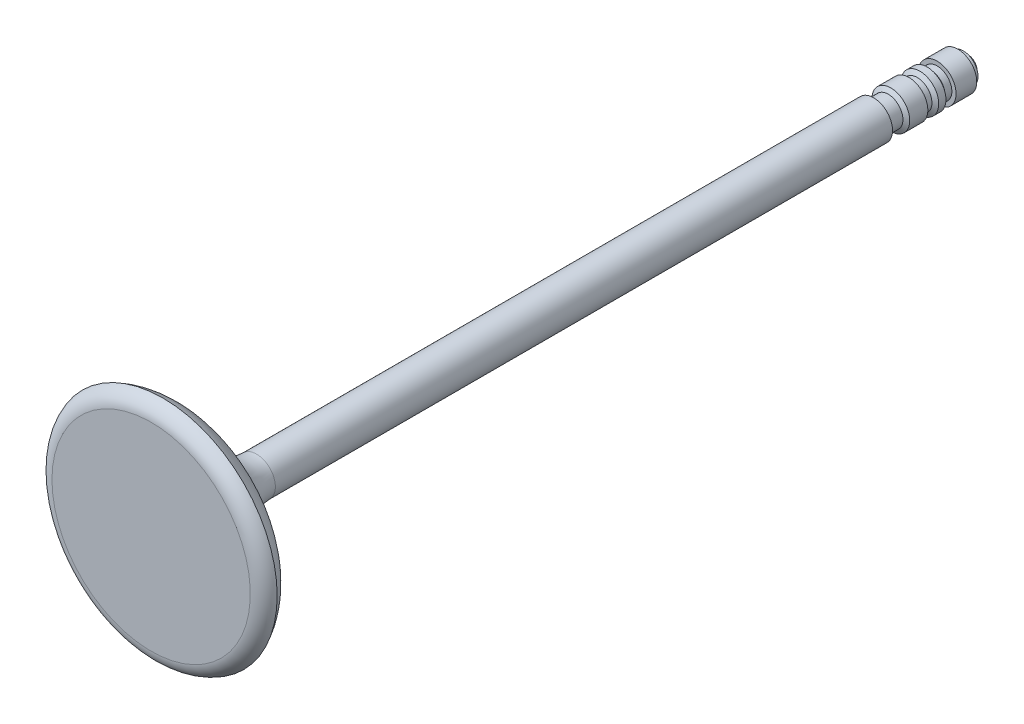
ISO-10303-21;
HEADER;
FILE_DESCRIPTION(('STEP AP214'),'2;1');
FILE_NAME('part.step','',(''),(''),'','','');
FILE_SCHEMA(('AUTOMOTIVE_DESIGN { 1 0 10303 214 1 1 1 1 }'));
ENDSEC;
DATA;
#1=APPLICATION_CONTEXT('core data for automotive mechanical design processes');
#2=APPLICATION_PROTOCOL_DEFINITION('international standard','automotive_design',2000,#1);
#3=PRODUCT_CONTEXT('',#1,'mechanical');
#4=PRODUCT('Part','Part','',(#3));
#5=PRODUCT_RELATED_PRODUCT_CATEGORY('part','',(#4));
#6=PRODUCT_DEFINITION_FORMATION('','',#4);
#7=PRODUCT_DEFINITION_CONTEXT('part definition',#1,'design');
#8=PRODUCT_DEFINITION('design','',#6,#7);
#9=PRODUCT_DEFINITION_SHAPE('','',#8);
#10=(LENGTH_UNIT() NAMED_UNIT(*) SI_UNIT(.MILLI.,.METRE.));
#11=(NAMED_UNIT(*) PLANE_ANGLE_UNIT() SI_UNIT($,.RADIAN.));
#12=(NAMED_UNIT(*) SI_UNIT($,.STERADIAN.) SOLID_ANGLE_UNIT());
#13=UNCERTAINTY_MEASURE_WITH_UNIT(LENGTH_MEASURE(1.E-05),#10,'distance_accuracy_value','');
#14=(GEOMETRIC_REPRESENTATION_CONTEXT(3) GLOBAL_UNCERTAINTY_ASSIGNED_CONTEXT((#13)) GLOBAL_UNIT_ASSIGNED_CONTEXT((#10,
#11,#12)) REPRESENTATION_CONTEXT('',''));
#15=CARTESIAN_POINT('',(0.,0.,0.));
#16=DIRECTION('',(0.,0.,1.));
#17=DIRECTION('',(1.,0.,0.));
#18=AXIS2_PLACEMENT_3D('',#15,#16,#17);
#19=CARTESIAN_POINT('',(0.,1.16638837123823,-55.5535093372513));
#20=DIRECTION('',(0.,0.,-1.));
#21=DIRECTION('',(-1.,0.,0.));
#22=AXIS2_PLACEMENT_3D('',#19,#20,#21);
#23=PLANE('',#22);
#24=CARTESIAN_POINT('',(0.,0.,-55.5535093372513));
#25=DIRECTION('',(0.,0.,-1.));
#26=DIRECTION('',(-1.,0.,0.));
#27=AXIS2_PLACEMENT_3D('',#24,#25,#26);
#28=CIRCLE('',#27,1.16638837123823);
#29=CARTESIAN_POINT('',(-1.16638837123823,0.,-55.5535093372513));
#30=VERTEX_POINT('',#29);
#31=EDGE_CURVE('E104',#30,#30,#28,.T.);
#32=ORIENTED_EDGE('',*,*,#31,.T.);
#33=EDGE_LOOP('',(#32));
#34=FACE_BOUND('',#33,.T.);
#35=ADVANCED_FACE('F31',(#34),#23,.T.);
#36=CARTESIAN_POINT('',(0.,0.,41.6926663307237));
#37=DIRECTION('',(0.,0.,1.));
#38=DIRECTION('',(1.,0.,0.));
#39=AXIS2_PLACEMENT_3D('',#36,#37,#38);
#40=PLANE('',#39);
#41=CARTESIAN_POINT('',(0.,0.,41.6926663307237));
#42=DIRECTION('',(0.,0.,-1.));
#43=DIRECTION('',(-1.,0.,0.));
#44=AXIS2_PLACEMENT_3D('',#41,#42,#43);
#45=CIRCLE('',#44,11.8145207994044);
#46=CARTESIAN_POINT('',(-11.8145207994044,0.,41.6926663307237));
#47=VERTEX_POINT('',#46);
#48=EDGE_CURVE('E10',#47,#47,#45,.T.);
#49=ORIENTED_EDGE('',*,*,#48,.F.);
#50=EDGE_LOOP('',(#49));
#51=FACE_BOUND('',#50,.T.);
#52=ADVANCED_FACE('F121',(#51),#40,.T.);
#53=CARTESIAN_POINT('',(0.,0.,39.7150754554662));
#54=DIRECTION('',(0.,0.,-1.));
#55=DIRECTION('',(-1.,0.,0.));
#56=AXIS2_PLACEMENT_3D('',#53,#54,#55);
#57=TOROIDAL_SURFACE('',#56,11.7000258549691,1.98090251203921);
#58=ORIENTED_EDGE('',*,*,#48,.T.);
#59=EDGE_LOOP('',(#58));
#60=FACE_BOUND('',#59,.T.);
#61=CARTESIAN_POINT('',(0.,0.,40.2754976270629));
#62=DIRECTION('',(0.,0.,-1.));
#63=DIRECTION('',(-1.,0.,0.));
#64=AXIS2_PLACEMENT_3D('',#61,#62,#63);
#65=CIRCLE('',#64,13.6);
#66=CARTESIAN_POINT('',(-13.6,0.,40.2754976270629));
#67=VERTEX_POINT('',#66);
#68=EDGE_CURVE('E37',#67,#67,#65,.T.);
#69=ORIENTED_EDGE('',*,*,#68,.F.);
#70=EDGE_LOOP('',(#69));
#71=FACE_BOUND('',#70,.T.);
#72=ADVANCED_FACE('F125',(#60,#71),#57,.T.);
#73=CARTESIAN_POINT('',(0.,0.,42.939002370741));
#74=DIRECTION('',(0.,0.,-1.));
#75=DIRECTION('',(-1.,0.,0.));
#76=AXIS2_PLACEMENT_3D('',#73,#74,#75);
#77=TOROIDAL_SURFACE('',#76,8.25841732216449,5.9688158812069);
#78=ORIENTED_EDGE('',*,*,#68,.T.);
#79=EDGE_LOOP('',(#78));
#80=FACE_BOUND('',#79,.T.);
#81=CARTESIAN_POINT('',(0.,0.,37.1473453450744));
#82=DIRECTION('',(0.,0.,-1.));
#83=DIRECTION('',(-1.,0.,0.));
#84=AXIS2_PLACEMENT_3D('',#81,#82,#83);
#85=CIRCLE('',#84,9.70184100244503);
#86=CARTESIAN_POINT('',(-9.70184100244503,0.,37.1473453450744));
#87=VERTEX_POINT('',#86);
#88=EDGE_CURVE('E41',#87,#87,#85,.T.);
#89=ORIENTED_EDGE('',*,*,#88,.F.);
#90=EDGE_LOOP('',(#89));
#91=FACE_BOUND('',#90,.T.);
#92=ADVANCED_FACE('F130',(#80,#91),#77,.T.);
#93=CARTESIAN_POINT('',(0.,0.,25.9372608460601));
#94=DIRECTION('',(0.,0.,-1.));
#95=DIRECTION('',(-1.,0.,0.));
#96=AXIS2_PLACEMENT_3D('',#93,#94,#95);
#97=TOROIDAL_SURFACE('',#96,12.9036930871317,11.6583811589454);
#98=ORIENTED_EDGE('',*,*,#88,.T.);
#99=EDGE_LOOP('',(#98));
#100=FACE_BOUND('',#99,.T.);
#101=CARTESIAN_POINT('',(0.,0.,32.8160575700133));
#102=DIRECTION('',(0.,0.,-1.));
#103=DIRECTION('',(-1.,0.,0.));
#104=AXIS2_PLACEMENT_3D('',#101,#102,#103);
#105=CIRCLE('',#104,3.4909354211879);
#106=CARTESIAN_POINT('',(-3.4909354211879,0.,32.8160575700133));
#107=VERTEX_POINT('',#106);
#108=EDGE_CURVE('E45',#107,#107,#105,.T.);
#109=ORIENTED_EDGE('',*,*,#108,.F.);
#110=EDGE_LOOP('',(#109));
#111=FACE_BOUND('',#110,.T.);
#112=ADVANCED_FACE('F135',(#100,#111),#97,.F.);
#113=CARTESIAN_POINT('',(0.,0.,29.2827180363812));
#114=DIRECTION('',(0.,0.,-1.));
#115=DIRECTION('',(-1.,0.,0.));
#116=AXIS2_PLACEMENT_3D('',#113,#114,#115);
#117=TOROIDAL_SURFACE('',#116,7.8925361203285,5.64434026034951);
#118=ORIENTED_EDGE('',*,*,#108,.T.);
#119=EDGE_LOOP('',(#118));
#120=FACE_BOUND('',#119,.T.);
#121=CARTESIAN_POINT('',(0.,0.,29.1400186832274));
#122=DIRECTION('',(0.,0.,-1.));
#123=DIRECTION('',(-1.,0.,0.));
#124=AXIS2_PLACEMENT_3D('',#121,#122,#123);
#125=CIRCLE('',#124,2.24999999999999);
#126=CARTESIAN_POINT('',(-2.24999999999999,0.,29.1400186832274));
#127=VERTEX_POINT('',#126);
#128=EDGE_CURVE('E50',#127,#127,#125,.T.);
#129=ORIENTED_EDGE('',*,*,#128,.F.);
#130=EDGE_LOOP('',(#129));
#131=FACE_BOUND('',#130,.T.);
#132=ADVANCED_FACE('F138',(#120,#131),#117,.F.);
#133=CARTESIAN_POINT('',(0.,0.,-55.5535093372513));
#134=DIRECTION('',(0.,0.,-1.));
#135=DIRECTION('',(-1.,0.,0.));
#136=AXIS2_PLACEMENT_3D('',#133,#134,#135);
#137=CYLINDRICAL_SURFACE('',#136,2.24999999999999);
#138=ORIENTED_EDGE('',*,*,#128,.T.);
#139=EDGE_LOOP('',(#138));
#140=FACE_BOUND('',#139,.T.);
#141=CARTESIAN_POINT('',(0.,0.,-44.3826387920539));
#142=DIRECTION('',(0.,0.,-1.));
#143=DIRECTION('',(-1.,0.,0.));
#144=AXIS2_PLACEMENT_3D('',#141,#142,#143);
#145=CIRCLE('',#144,2.24999999999999);
#146=CARTESIAN_POINT('',(-2.24999999999999,0.,-44.3826387920539));
#147=VERTEX_POINT('',#146);
#148=EDGE_CURVE('E53',#147,#147,#145,.T.);
#149=ORIENTED_EDGE('',*,*,#148,.F.);
#150=EDGE_LOOP('',(#149));
#151=FACE_BOUND('',#150,.T.);
#152=ADVANCED_FACE('F142',(#140,#151),#137,.T.);
#153=CARTESIAN_POINT('',(0.,2.24999999999999,-44.3826387920539));
#154=DIRECTION('',(0.,0.,-1.));
#155=DIRECTION('',(-1.,0.,0.));
#156=AXIS2_PLACEMENT_3D('',#153,#154,#155);
#157=PLANE('',#156);
#158=ORIENTED_EDGE('',*,*,#148,.T.);
#159=EDGE_LOOP('',(#158));
#160=FACE_BOUND('',#159,.T.);
#161=CARTESIAN_POINT('',(0.,0.,-44.3826387920539));
#162=DIRECTION('',(0.,0.,-1.));
#163=DIRECTION('',(-1.,0.,0.));
#164=AXIS2_PLACEMENT_3D('',#161,#162,#163);
#165=CIRCLE('',#164,1.75246230691345);
#166=CARTESIAN_POINT('',(-1.75246230691345,0.,-44.3826387920539));
#167=VERTEX_POINT('',#166);
#168=EDGE_CURVE('E56',#167,#167,#165,.T.);
#169=ORIENTED_EDGE('',*,*,#168,.F.);
#170=EDGE_LOOP('',(#169));
#171=FACE_BOUND('',#170,.T.);
#172=ADVANCED_FACE('F146',(#160,#171),#157,.T.);
#173=CARTESIAN_POINT('',(0.,0.,-55.5535093372513));
#174=DIRECTION('',(0.,0.,-1.));
#175=DIRECTION('',(-1.,0.,0.));
#176=AXIS2_PLACEMENT_3D('',#173,#174,#175);
#177=CYLINDRICAL_SURFACE('',#176,1.75246230691345);
#178=ORIENTED_EDGE('',*,*,#168,.T.);
#179=EDGE_LOOP('',(#178));
#180=FACE_BOUND('',#179,.T.);
#181=CARTESIAN_POINT('',(0.,0.,-46.1189702404947));
#182=DIRECTION('',(0.,0.,-1.));
#183=DIRECTION('',(-1.,0.,0.));
#184=AXIS2_PLACEMENT_3D('',#181,#182,#183);
#185=CIRCLE('',#184,1.75246230691345);
#186=CARTESIAN_POINT('',(-1.75246230691345,0.,-46.1189702404947));
#187=VERTEX_POINT('',#186);
#188=EDGE_CURVE('E59',#187,#187,#185,.T.);
#189=ORIENTED_EDGE('',*,*,#188,.F.);
#190=EDGE_LOOP('',(#189));
#191=FACE_BOUND('',#190,.T.);
#192=ADVANCED_FACE('F150',(#180,#191),#177,.T.);
#193=CARTESIAN_POINT('',(0.,0.,-46.4274302066395));
#194=DIRECTION('',(0.,0.,-1.));
#195=DIRECTION('',(-1.,0.,0.));
#196=AXIS2_PLACEMENT_3D('',#193,#194,#195);
#197=CONICAL_SURFACE('',#196,2.24999999999998,1.01582005924449);
#198=ORIENTED_EDGE('',*,*,#188,.T.);
#199=EDGE_LOOP('',(#198));
#200=FACE_BOUND('',#199,.T.);
#201=CARTESIAN_POINT('',(0.,0.,-46.4274302066395));
#202=DIRECTION('',(0.,0.,-1.));
#203=DIRECTION('',(-1.,0.,0.));
#204=AXIS2_PLACEMENT_3D('',#201,#202,#203);
#205=CIRCLE('',#204,2.24999999999998);
#206=CARTESIAN_POINT('',(-2.24999999999998,0.,-46.4274302066395));
#207=VERTEX_POINT('',#206);
#208=EDGE_CURVE('E62',#207,#207,#205,.T.);
#209=ORIENTED_EDGE('',*,*,#208,.F.);
#210=EDGE_LOOP('',(#209));
#211=FACE_BOUND('',#210,.T.);
#212=ADVANCED_FACE('F154',(#200,#211),#197,.T.);
#213=CARTESIAN_POINT('',(0.,0.,-55.5535093372513));
#214=DIRECTION('',(0.,0.,-1.));
#215=DIRECTION('',(-1.,0.,0.));
#216=AXIS2_PLACEMENT_3D('',#213,#214,#215);
#217=CYLINDRICAL_SURFACE('',#216,2.24999999999998);
#218=ORIENTED_EDGE('',*,*,#208,.T.);
#219=EDGE_LOOP('',(#218));
#220=FACE_BOUND('',#219,.T.);
#221=CARTESIAN_POINT('',(0.,0.,-48.5866499696535));
#222=DIRECTION('',(0.,0.,-1.));
#223=DIRECTION('',(-1.,0.,0.));
#224=AXIS2_PLACEMENT_3D('',#221,#222,#223);
#225=CIRCLE('',#224,2.24999999999998);
#226=CARTESIAN_POINT('',(-2.24999999999998,0.,-48.5866499696535));
#227=VERTEX_POINT('',#226);
#228=EDGE_CURVE('E65',#227,#227,#225,.T.);
#229=ORIENTED_EDGE('',*,*,#228,.F.);
#230=EDGE_LOOP('',(#229));
#231=FACE_BOUND('',#230,.T.);
#232=ADVANCED_FACE('F158',(#220,#231),#217,.T.);
#233=CARTESIAN_POINT('',(0.,2.24999999999998,-48.5866499696535));
#234=DIRECTION('',(0.,0.,-1.));
#235=DIRECTION('',(-1.,0.,0.));
#236=AXIS2_PLACEMENT_3D('',#233,#234,#235);
#237=PLANE('',#236);
#238=ORIENTED_EDGE('',*,*,#228,.T.);
#239=EDGE_LOOP('',(#238));
#240=FACE_BOUND('',#239,.T.);
#241=CARTESIAN_POINT('',(0.,0.,-48.5866499696535));
#242=DIRECTION('',(0.,0.,-1.));
#243=DIRECTION('',(-1.,0.,0.));
#244=AXIS2_PLACEMENT_3D('',#241,#242,#243);
#245=CIRCLE('',#244,1.75246230691345);
#246=CARTESIAN_POINT('',(-1.75246230691345,0.,-48.5866499696535));
#247=VERTEX_POINT('',#246);
#248=EDGE_CURVE('E68',#247,#247,#245,.T.);
#249=ORIENTED_EDGE('',*,*,#248,.F.);
#250=EDGE_LOOP('',(#249));
#251=FACE_BOUND('',#250,.T.);
#252=ADVANCED_FACE('F162',(#240,#251),#237,.T.);
#253=CARTESIAN_POINT('',(0.,0.,-55.5535093372513));
#254=DIRECTION('',(0.,0.,-1.));
#255=DIRECTION('',(-1.,0.,0.));
#256=AXIS2_PLACEMENT_3D('',#253,#254,#255);
#257=CYLINDRICAL_SURFACE('',#256,1.75246230691345);
#258=ORIENTED_EDGE('',*,*,#248,.T.);
#259=EDGE_LOOP('',(#258));
#260=FACE_BOUND('',#259,.T.);
#261=CARTESIAN_POINT('',(0.,0.,-49.5737218613171));
#262=DIRECTION('',(0.,0.,-1.));
#263=DIRECTION('',(-1.,0.,0.));
#264=AXIS2_PLACEMENT_3D('',#261,#262,#263);
#265=CIRCLE('',#264,1.75246230691345);
#266=CARTESIAN_POINT('',(-1.75246230691345,0.,-49.5737218613171));
#267=VERTEX_POINT('',#266);
#268=EDGE_CURVE('E71',#267,#267,#265,.T.);
#269=ORIENTED_EDGE('',*,*,#268,.F.);
#270=EDGE_LOOP('',(#269));
#271=FACE_BOUND('',#270,.T.);
#272=ADVANCED_FACE('F166',(#260,#271),#257,.T.);
#273=CARTESIAN_POINT('',(0.,0.,-49.8821818274619));
#274=DIRECTION('',(0.,0.,-1.));
#275=DIRECTION('',(-1.,0.,0.));
#276=AXIS2_PLACEMENT_3D('',#273,#274,#275);
#277=CONICAL_SURFACE('',#276,2.24999999999998,1.01582005924449);
#278=ORIENTED_EDGE('',*,*,#268,.T.);
#279=EDGE_LOOP('',(#278));
#280=FACE_BOUND('',#279,.T.);
#281=CARTESIAN_POINT('',(0.,0.,-49.8821818274619));
#282=DIRECTION('',(0.,0.,-1.));
#283=DIRECTION('',(-1.,0.,0.));
#284=AXIS2_PLACEMENT_3D('',#281,#282,#283);
#285=CIRCLE('',#284,2.24999999999998);
#286=CARTESIAN_POINT('',(-2.24999999999998,0.,-49.8821818274619));
#287=VERTEX_POINT('',#286);
#288=EDGE_CURVE('E74',#287,#287,#285,.T.);
#289=ORIENTED_EDGE('',*,*,#288,.F.);
#290=EDGE_LOOP('',(#289));
#291=FACE_BOUND('',#290,.T.);
#292=ADVANCED_FACE('F170',(#280,#291),#277,.T.);
#293=CARTESIAN_POINT('',(0.,0.,-55.5535093372513));
#294=DIRECTION('',(0.,0.,-1.));
#295=DIRECTION('',(-1.,0.,0.));
#296=AXIS2_PLACEMENT_3D('',#293,#294,#295);
#297=CYLINDRICAL_SURFACE('',#296,2.24999999999998);
#298=ORIENTED_EDGE('',*,*,#288,.T.);
#299=EDGE_LOOP('',(#298));
#300=FACE_BOUND('',#299,.T.);
#301=CARTESIAN_POINT('',(0.,0.,-50.7458697326676));
#302=DIRECTION('',(0.,0.,-1.));
#303=DIRECTION('',(-1.,0.,0.));
#304=AXIS2_PLACEMENT_3D('',#301,#302,#303);
#305=CIRCLE('',#304,2.24999999999998);
#306=CARTESIAN_POINT('',(-2.24999999999998,0.,-50.7458697326676));
#307=VERTEX_POINT('',#306);
#308=EDGE_CURVE('E77',#307,#307,#305,.T.);
#309=ORIENTED_EDGE('',*,*,#308,.F.);
#310=EDGE_LOOP('',(#309));
#311=FACE_BOUND('',#310,.T.);
#312=ADVANCED_FACE('F174',(#300,#311),#297,.T.);
#313=CARTESIAN_POINT('',(0.,2.24999999999998,-50.7458697326676));
#314=DIRECTION('',(0.,0.,-1.));
#315=DIRECTION('',(-1.,0.,0.));
#316=AXIS2_PLACEMENT_3D('',#313,#314,#315);
#317=PLANE('',#316);
#318=ORIENTED_EDGE('',*,*,#308,.T.);
#319=EDGE_LOOP('',(#318));
#320=FACE_BOUND('',#319,.T.);
#321=CARTESIAN_POINT('',(0.,0.,-50.7458697326676));
#322=DIRECTION('',(0.,0.,-1.));
#323=DIRECTION('',(-1.,0.,0.));
#324=AXIS2_PLACEMENT_3D('',#321,#322,#323);
#325=CIRCLE('',#324,2.00123115345671);
#326=CARTESIAN_POINT('',(-2.00123115345671,0.,-50.7458697326676));
#327=VERTEX_POINT('',#326);
#328=EDGE_CURVE('E80',#327,#327,#325,.T.);
#329=ORIENTED_EDGE('',*,*,#328,.F.);
#330=EDGE_LOOP('',(#329));
#331=FACE_BOUND('',#330,.T.);
#332=ADVANCED_FACE('F178',(#320,#331),#317,.T.);
#333=CARTESIAN_POINT('',(0.,0.,-51.1471272428976));
#334=DIRECTION('',(0.,0.,1.));
#335=DIRECTION('',(1.,0.,0.));
#336=AXIS2_PLACEMENT_3D('',#333,#334,#335);
#337=CONICAL_SURFACE('',#336,1.75246230691345,0.55497626755041);
#338=ORIENTED_EDGE('',*,*,#328,.T.);
#339=EDGE_LOOP('',(#338));
#340=FACE_BOUND('',#339,.T.);
#341=CARTESIAN_POINT('',(0.,0.,-51.1471272428976));
#342=DIRECTION('',(0.,0.,-1.));
#343=DIRECTION('',(-1.,0.,0.));
#344=AXIS2_PLACEMENT_3D('',#341,#342,#343);
#345=CIRCLE('',#344,1.75246230691345);
#346=CARTESIAN_POINT('',(-1.75246230691345,0.,-51.1471272428976));
#347=VERTEX_POINT('',#346);
#348=EDGE_CURVE('E83',#347,#347,#345,.T.);
#349=ORIENTED_EDGE('',*,*,#348,.F.);
#350=EDGE_LOOP('',(#349));
#351=FACE_BOUND('',#350,.T.);
#352=ADVANCED_FACE('F182',(#340,#351),#337,.T.);
#353=CARTESIAN_POINT('',(0.,0.,-55.5535093372513));
#354=DIRECTION('',(0.,0.,-1.));
#355=DIRECTION('',(-1.,0.,0.));
#356=AXIS2_PLACEMENT_3D('',#353,#354,#355);
#357=CYLINDRICAL_SURFACE('',#356,1.75246230691345);
#358=ORIENTED_EDGE('',*,*,#348,.T.);
#359=EDGE_LOOP('',(#358));
#360=FACE_BOUND('',#359,.T.);
#361=CARTESIAN_POINT('',(0.,0.,-51.9488636006325));
#362=DIRECTION('',(0.,0.,-1.));
#363=DIRECTION('',(-1.,0.,0.));
#364=AXIS2_PLACEMENT_3D('',#361,#362,#363);
#365=CIRCLE('',#364,1.75246230691345);
#366=CARTESIAN_POINT('',(-1.75246230691345,0.,-51.9488636006325));
#367=VERTEX_POINT('',#366);
#368=EDGE_CURVE('E86',#367,#367,#365,.T.);
#369=ORIENTED_EDGE('',*,*,#368,.F.);
#370=EDGE_LOOP('',(#369));
#371=FACE_BOUND('',#370,.T.);
#372=ADVANCED_FACE('F186',(#360,#371),#357,.T.);
#373=CARTESIAN_POINT('',(0.,1.75246230691345,-51.9488636006325));
#374=DIRECTION('',(0.,0.,1.));
#375=DIRECTION('',(1.,0.,0.));
#376=AXIS2_PLACEMENT_3D('',#373,#374,#375);
#377=PLANE('',#376);
#378=ORIENTED_EDGE('',*,*,#368,.T.);
#379=EDGE_LOOP('',(#378));
#380=FACE_BOUND('',#379,.T.);
#381=CARTESIAN_POINT('',(0.,0.,-51.9488636006325));
#382=DIRECTION('',(0.,0.,-1.));
#383=DIRECTION('',(-1.,0.,0.));
#384=AXIS2_PLACEMENT_3D('',#381,#382,#383);
#385=CIRCLE('',#384,2.24999999999999);
#386=CARTESIAN_POINT('',(-2.24999999999999,0.,-51.9488636006325));
#387=VERTEX_POINT('',#386);
#388=EDGE_CURVE('E89',#387,#387,#385,.T.);
#389=ORIENTED_EDGE('',*,*,#388,.F.);
#390=EDGE_LOOP('',(#389));
#391=FACE_BOUND('',#390,.T.);
#392=ADVANCED_FACE('F190',(#380,#391),#377,.T.);
#393=CARTESIAN_POINT('',(0.,0.,-55.5535093372513));
#394=DIRECTION('',(0.,0.,-1.));
#395=DIRECTION('',(-1.,0.,0.));
#396=AXIS2_PLACEMENT_3D('',#393,#394,#395);
#397=CYLINDRICAL_SURFACE('',#396,2.24999999999999);
#398=ORIENTED_EDGE('',*,*,#388,.T.);
#399=EDGE_LOOP('',(#398));
#400=FACE_BOUND('',#399,.T.);
#401=CARTESIAN_POINT('',(0.,0.,-54.4165433297914));
#402=DIRECTION('',(0.,0.,-1.));
#403=DIRECTION('',(-1.,0.,0.));
#404=AXIS2_PLACEMENT_3D('',#401,#402,#403);
#405=CIRCLE('',#404,2.24999999999999);
#406=CARTESIAN_POINT('',(-2.24999999999999,0.,-54.4165433297914));
#407=VERTEX_POINT('',#406);
#408=EDGE_CURVE('E92',#407,#407,#405,.T.);
#409=ORIENTED_EDGE('',*,*,#408,.F.);
#410=EDGE_LOOP('',(#409));
#411=FACE_BOUND('',#410,.T.);
#412=ADVANCED_FACE('F194',(#400,#411),#397,.T.);
#413=CARTESIAN_POINT('',(0.,2.24999999999999,-54.4165433297914));
#414=DIRECTION('',(0.,0.,-1.));
#415=DIRECTION('',(-1.,0.,0.));
#416=AXIS2_PLACEMENT_3D('',#413,#414,#415);
#417=PLANE('',#416);
#418=ORIENTED_EDGE('',*,*,#408,.T.);
#419=EDGE_LOOP('',(#418));
#420=FACE_BOUND('',#419,.T.);
#421=CARTESIAN_POINT('',(0.,0.,-54.4165433297914));
#422=DIRECTION('',(0.,0.,-1.));
#423=DIRECTION('',(-1.,0.,0.));
#424=AXIS2_PLACEMENT_3D('',#421,#422,#423);
#425=CIRCLE('',#424,1.75246230691346);
#426=CARTESIAN_POINT('',(-1.75246230691346,0.,-54.4165433297914));
#427=VERTEX_POINT('',#426);
#428=EDGE_CURVE('E95',#427,#427,#425,.T.);
#429=ORIENTED_EDGE('',*,*,#428,.F.);
#430=EDGE_LOOP('',(#429));
#431=FACE_BOUND('',#430,.T.);
#432=ADVANCED_FACE('F198',(#420,#431),#417,.T.);
#433=CARTESIAN_POINT('',(0.,0.,-55.5535093372513));
#434=DIRECTION('',(0.,0.,-1.));
#435=DIRECTION('',(-1.,0.,0.));
#436=AXIS2_PLACEMENT_3D('',#433,#434,#435);
#437=CYLINDRICAL_SURFACE('',#436,1.75246230691346);
#438=ORIENTED_EDGE('',*,*,#428,.T.);
#439=EDGE_LOOP('',(#438));
#440=FACE_BOUND('',#439,.T.);
#441=CARTESIAN_POINT('',(0.,0.,-55.0643092586956));
#442=DIRECTION('',(0.,0.,-1.));
#443=DIRECTION('',(-1.,0.,0.));
#444=AXIS2_PLACEMENT_3D('',#441,#442,#443);
#445=CIRCLE('',#444,1.75246230691346);
#446=CARTESIAN_POINT('',(-1.75246230691346,0.,-55.0643092586956));
#447=VERTEX_POINT('',#446);
#448=EDGE_CURVE('E98',#447,#447,#445,.T.);
#449=ORIENTED_EDGE('',*,*,#448,.F.);
#450=EDGE_LOOP('',(#449));
#451=FACE_BOUND('',#450,.T.);
#452=ADVANCED_FACE('F117',(#440,#451),#437,.T.);
#453=CARTESIAN_POINT('',(0.,1.75246230691346,-55.0643092586956));
#454=DIRECTION('',(0.,0.,-1.));
#455=DIRECTION('',(-1.,0.,0.));
#456=AXIS2_PLACEMENT_3D('',#453,#454,#455);
#457=PLANE('',#456);
#458=ORIENTED_EDGE('',*,*,#448,.T.);
#459=EDGE_LOOP('',(#458));
#460=FACE_BOUND('',#459,.T.);
#461=CARTESIAN_POINT('',(0.,0.,-55.0643092586956));
#462=DIRECTION('',(0.,0.,-1.));
#463=DIRECTION('',(-1.,0.,0.));
#464=AXIS2_PLACEMENT_3D('',#461,#462,#463);
#465=CIRCLE('',#464,1.16638837123823);
#466=CARTESIAN_POINT('',(-1.16638837123823,0.,-55.0643092586956));
#467=VERTEX_POINT('',#466);
#468=EDGE_CURVE('E101',#467,#467,#465,.T.);
#469=ORIENTED_EDGE('',*,*,#468,.F.);
#470=EDGE_LOOP('',(#469));
#471=FACE_BOUND('',#470,.T.);
#472=ADVANCED_FACE('F111',(#460,#471),#457,.T.);
#473=CARTESIAN_POINT('',(0.,0.,-55.5535093372513));
#474=DIRECTION('',(0.,0.,-1.));
#475=DIRECTION('',(-1.,0.,0.));
#476=AXIS2_PLACEMENT_3D('',#473,#474,#475);
#477=CYLINDRICAL_SURFACE('',#476,1.16638837123823);
#478=ORIENTED_EDGE('',*,*,#468,.T.);
#479=EDGE_LOOP('',(#478));
#480=FACE_BOUND('',#479,.T.);
#481=ORIENTED_EDGE('',*,*,#31,.F.);
#482=EDGE_LOOP('',(#481));
#483=FACE_BOUND('',#482,.T.);
#484=ADVANCED_FACE('F109',(#480,#483),#477,.T.);
#485=CLOSED_SHELL('',(#35,#52,#72,#92,#112,#132,#152,#172,#192,#212,#232,#252,#272,#292,#312,
#332,#352,#372,#392,#412,#432,#452,#472,#484));
#486=MANIFOLD_SOLID_BREP('B2',#485);
#487=ADVANCED_BREP_SHAPE_REPRESENTATION('',(#18,#486),#14);
#488=SHAPE_DEFINITION_REPRESENTATION(#9,#487);
ENDSEC;
END-ISO-10303-21;
